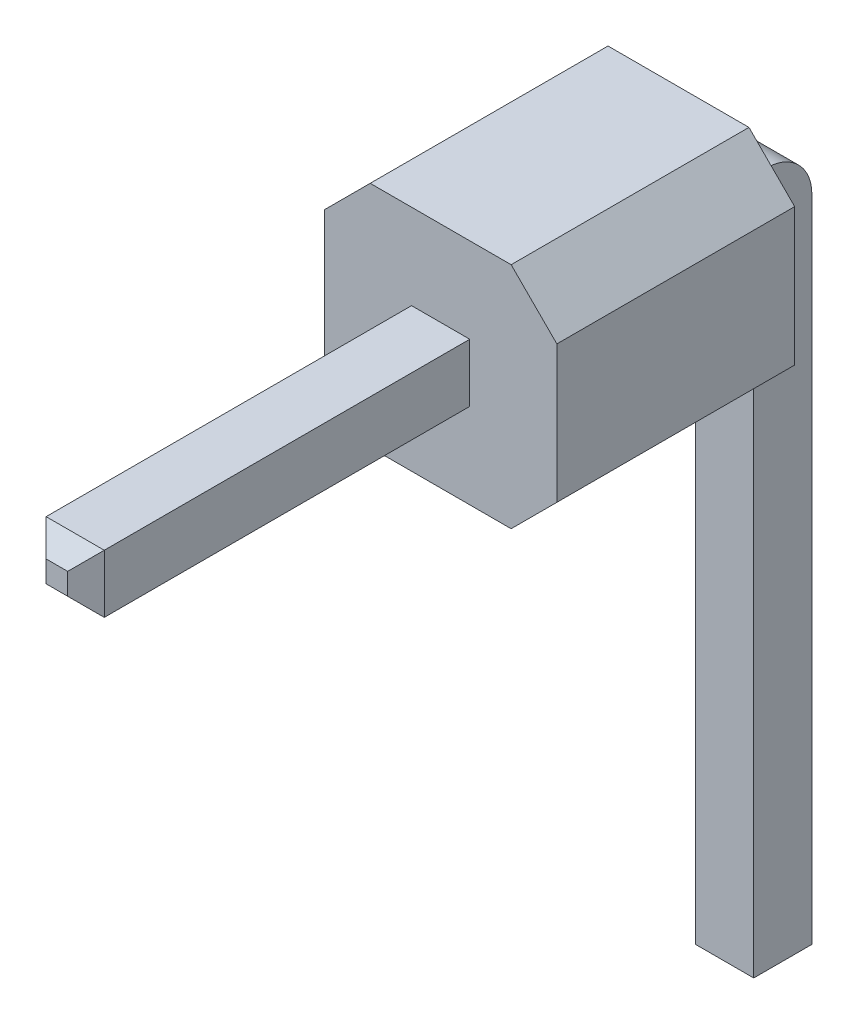
ISO-10303-21;
HEADER;
FILE_DESCRIPTION(('STEP AP214'),'2;1');
FILE_NAME('part.step','',(''),(''),'','','');
FILE_SCHEMA(('AUTOMOTIVE_DESIGN { 1 0 10303 214 1 1 1 1 }'));
ENDSEC;
DATA;
#1=APPLICATION_CONTEXT('core data for automotive mechanical design processes');
#2=APPLICATION_PROTOCOL_DEFINITION('international standard','automotive_design',2000,#1);
#3=PRODUCT_CONTEXT('',#1,'mechanical');
#4=PRODUCT('Part','Part','',(#3));
#5=PRODUCT_RELATED_PRODUCT_CATEGORY('part','',(#4));
#6=PRODUCT_DEFINITION_FORMATION('','',#4);
#7=PRODUCT_DEFINITION_CONTEXT('part definition',#1,'design');
#8=PRODUCT_DEFINITION('design','',#6,#7);
#9=PRODUCT_DEFINITION_SHAPE('','',#8);
#10=(LENGTH_UNIT() NAMED_UNIT(*) SI_UNIT(.MILLI.,.METRE.));
#11=(NAMED_UNIT(*) PLANE_ANGLE_UNIT() SI_UNIT($,.RADIAN.));
#12=(NAMED_UNIT(*) SI_UNIT($,.STERADIAN.) SOLID_ANGLE_UNIT());
#13=UNCERTAINTY_MEASURE_WITH_UNIT(LENGTH_MEASURE(1.E-05),#10,'distance_accuracy_value','');
#14=(GEOMETRIC_REPRESENTATION_CONTEXT(3) GLOBAL_UNCERTAINTY_ASSIGNED_CONTEXT((#13)) GLOBAL_UNIT_ASSIGNED_CONTEXT((#10,
#11,#12)) REPRESENTATION_CONTEXT('',''));
#15=CARTESIAN_POINT('',(0.,0.,0.));
#16=DIRECTION('',(0.,0.,1.));
#17=DIRECTION('',(1.,0.,0.));
#18=AXIS2_PLACEMENT_3D('',#15,#16,#17);
#19=CARTESIAN_POINT('',(0.148245527546587,-0.219972769428293,3.9));
#20=DIRECTION('',(0.,0.,1.));
#21=DIRECTION('',(1.,0.,0.));
#22=AXIS2_PLACEMENT_3D('',#19,#20,#21);
#23=PLANE('',#22);
#24=DIRECTION('',(0.,1.,0.));
#25=VECTOR('',#24,1.);
#26=CARTESIAN_POINT('',(0.148245527546587,0.416027230571708,3.9));
#27=LINE('',#26,#25);
#28=CARTESIAN_POINT('',(0.148245527546587,-0.219972769428293,3.9));
#29=VERTEX_POINT('',#28);
#30=CARTESIAN_POINT('',(0.148245527546587,0.416027230571708,3.9));
#31=VERTEX_POINT('',#30);
#32=EDGE_CURVE('P0_E11',#29,#31,#27,.T.);
#33=ORIENTED_EDGE('',*,*,#32,.T.);
#34=DIRECTION('',(-1.,0.,0.));
#35=VECTOR('',#34,1.);
#36=CARTESIAN_POINT('',(-0.487754472453413,0.416027230571707,3.9));
#37=LINE('',#36,#35);
#38=CARTESIAN_POINT('',(-0.487754472453413,0.416027230571707,3.9));
#39=VERTEX_POINT('',#38);
#40=EDGE_CURVE('P0_E29',#31,#39,#37,.T.);
#41=ORIENTED_EDGE('',*,*,#40,.T.);
#42=DIRECTION('',(0.,-1.,0.));
#43=VECTOR('',#42,1.);
#44=CARTESIAN_POINT('',(-0.487754472453413,0.416027230571707,3.9));
#45=LINE('',#44,#43);
#46=CARTESIAN_POINT('',(-0.487754472453413,-0.219972769428293,3.9));
#47=VERTEX_POINT('',#46);
#48=EDGE_CURVE('P0_E186',#39,#47,#45,.T.);
#49=ORIENTED_EDGE('',*,*,#48,.T.);
#50=DIRECTION('',(1.,0.,0.));
#51=VECTOR('',#50,1.);
#52=CARTESIAN_POINT('',(-0.487754472453413,-0.219972769428293,3.9));
#53=LINE('',#52,#51);
#54=EDGE_CURVE('P0_E184',#47,#29,#53,.T.);
#55=ORIENTED_EDGE('',*,*,#54,.T.);
#56=EDGE_LOOP('',(#33,#41,#49,#55));
#57=FACE_BOUND('',#56,.T.);
#58=ADVANCED_FACE('P0_F18',(#57),#23,.T.);
#59=CARTESIAN_POINT('',(0.148245527546587,0.416027230571708,1.3));
#60=DIRECTION('',(0.,0.,1.));
#61=DIRECTION('',(1.,0.,0.));
#62=AXIS2_PLACEMENT_3D('',#59,#60,#61);
#63=PLANE('',#62);
#64=DIRECTION('',(-1.,0.,0.));
#65=VECTOR('',#64,1.);
#66=CARTESIAN_POINT('',(-0.487754472453413,0.416027230571707,1.3));
#67=LINE('',#66,#65);
#68=CARTESIAN_POINT('',(0.148245527546587,0.416027230571708,1.3));
#69=VERTEX_POINT('',#68);
#70=CARTESIAN_POINT('',(-0.487754472453413,0.416027230571707,1.3));
#71=VERTEX_POINT('',#70);
#72=EDGE_CURVE('P0_E155',#69,#71,#67,.T.);
#73=ORIENTED_EDGE('',*,*,#72,.F.);
#74=DIRECTION('',(0.,1.,0.));
#75=VECTOR('',#74,1.);
#76=CARTESIAN_POINT('',(0.148245527546587,0.416027230571708,1.3));
#77=LINE('',#76,#75);
#78=CARTESIAN_POINT('',(0.148245527546587,-0.219972769428293,1.3));
#79=VERTEX_POINT('',#78);
#80=EDGE_CURVE('P0_E231',#79,#69,#77,.T.);
#81=ORIENTED_EDGE('',*,*,#80,.F.);
#82=DIRECTION('',(1.,0.,0.));
#83=VECTOR('',#82,1.);
#84=CARTESIAN_POINT('',(-0.487754472453413,-0.219972769428293,1.3));
#85=LINE('',#84,#83);
#86=CARTESIAN_POINT('',(-0.487754472453413,-0.219972769428293,1.3));
#87=VERTEX_POINT('',#86);
#88=EDGE_CURVE('P0_E214',#87,#79,#85,.T.);
#89=ORIENTED_EDGE('',*,*,#88,.F.);
#90=DIRECTION('',(0.,-1.,0.));
#91=VECTOR('',#90,1.);
#92=CARTESIAN_POINT('',(-0.487754472453413,0.416027230571707,1.3));
#93=LINE('',#92,#91);
#94=EDGE_CURVE('P0_E205',#71,#87,#93,.T.);
#95=ORIENTED_EDGE('',*,*,#94,.F.);
#96=EDGE_LOOP('',(#73,#81,#89,#95));
#97=FACE_BOUND('',#96,.T.);
#98=ADVANCED_FACE('P0_F388',(#97),#63,.F.);
#99=CARTESIAN_POINT('',(-1.44025447245341,0.848027230571708,3.9));
#100=DIRECTION('',(0.707106781186546,-0.707106781186549,0.));
#101=DIRECTION('',(0.,0.,-1.));
#102=AXIS2_PLACEMENT_3D('',#99,#100,#101);
#103=PLANE('',#102);
#104=DIRECTION('',(-0.707106781186549,-0.707106781186546,0.));
#105=VECTOR('',#104,1.);
#106=CARTESIAN_POINT('',(-1.19025447245341,1.09802723057171,3.9));
#107=LINE('',#106,#105);
#108=CARTESIAN_POINT('',(-0.940254472453412,1.34802723057171,3.9));
#109=VERTEX_POINT('',#108);
#110=CARTESIAN_POINT('',(-1.44025447245341,0.848027230571708,3.9));
#111=VERTEX_POINT('',#110);
#112=EDGE_CURVE('P0_E154',#109,#111,#107,.T.);
#113=ORIENTED_EDGE('',*,*,#112,.F.);
#114=DIRECTION('',(0.,0.,1.));
#115=VECTOR('',#114,1.);
#116=CARTESIAN_POINT('',(-0.940254472453412,1.34802723057171,3.9));
#117=LINE('',#116,#115);
#118=CARTESIAN_POINT('',(-0.940254472453412,1.34802723057171,1.3));
#119=VERTEX_POINT('',#118);
#120=EDGE_CURVE('P0_E372',#119,#109,#117,.T.);
#121=ORIENTED_EDGE('',*,*,#120,.F.);
#122=DIRECTION('',(0.707106781186549,0.707106781186546,0.));
#123=VECTOR('',#122,1.);
#124=CARTESIAN_POINT('',(-1.44025447245341,0.848027230571708,1.3));
#125=LINE('',#124,#123);
#126=CARTESIAN_POINT('',(-1.44025447245341,0.848027230571708,1.3));
#127=VERTEX_POINT('',#126);
#128=EDGE_CURVE('P0_E202',#127,#119,#125,.T.);
#129=ORIENTED_EDGE('',*,*,#128,.F.);
#130=DIRECTION('',(0.,0.,-1.));
#131=VECTOR('',#130,1.);
#132=CARTESIAN_POINT('',(-1.44025447245341,0.848027230571708,3.9));
#133=LINE('',#132,#131);
#134=EDGE_CURVE('P0_E206',#111,#127,#133,.T.);
#135=ORIENTED_EDGE('',*,*,#134,.F.);
#136=EDGE_LOOP('',(#113,#121,#129,#135));
#137=FACE_BOUND('',#136,.T.);
#138=ADVANCED_FACE('P0_F423',(#137),#103,.F.);
#139=CARTESIAN_POINT('',(-1.44025447245341,1.34802723057171,3.9));
#140=DIRECTION('',(0.,0.,1.));
#141=DIRECTION('',(1.,0.,0.));
#142=AXIS2_PLACEMENT_3D('',#139,#140,#141);
#143=PLANE('',#142);
#144=ORIENTED_EDGE('',*,*,#54,.F.);
#145=ORIENTED_EDGE('',*,*,#48,.F.);
#146=ORIENTED_EDGE('',*,*,#40,.F.);
#147=ORIENTED_EDGE('',*,*,#32,.F.);
#148=EDGE_LOOP('',(#144,#145,#146,#147));
#149=FACE_BOUND('',#148,.T.);
#150=DIRECTION('',(1.,0.,0.));
#151=VECTOR('',#150,1.);
#152=CARTESIAN_POINT('',(-1.44025447245341,-1.15197276942829,3.9));
#153=LINE('',#152,#151);
#154=CARTESIAN_POINT('',(-0.940254472453414,-1.15197276942829,3.9));
#155=VERTEX_POINT('',#154);
#156=CARTESIAN_POINT('',(0.600745527546586,-1.15197276942829,3.9));
#157=VERTEX_POINT('',#156);
#158=EDGE_CURVE('P0_E146',#155,#157,#153,.T.);
#159=ORIENTED_EDGE('',*,*,#158,.T.);
#160=DIRECTION('',(0.707106781186549,0.707106781186546,0.));
#161=VECTOR('',#160,1.);
#162=CARTESIAN_POINT('',(0.830245527546584,-0.922472769428297,3.9));
#163=LINE('',#162,#161);
#164=CARTESIAN_POINT('',(1.10074552754659,-0.651972769428294,3.9));
#165=VERTEX_POINT('',#164);
#166=EDGE_CURVE('P0_E150',#157,#165,#163,.T.);
#167=ORIENTED_EDGE('',*,*,#166,.T.);
#168=DIRECTION('',(0.,1.,0.));
#169=VECTOR('',#168,1.);
#170=CARTESIAN_POINT('',(1.10074552754659,1.34802723057171,3.9));
#171=LINE('',#170,#169);
#172=CARTESIAN_POINT('',(1.10074552754659,0.848027230571706,3.9));
#173=VERTEX_POINT('',#172);
#174=EDGE_CURVE('P0_E217',#165,#173,#171,.T.);
#175=ORIENTED_EDGE('',*,*,#174,.T.);
#176=DIRECTION('',(-0.707106781186546,0.707106781186549,0.));
#177=VECTOR('',#176,1.);
#178=CARTESIAN_POINT('',(-0.419754472453409,2.36852723057171,3.9));
#179=LINE('',#178,#177);
#180=CARTESIAN_POINT('',(0.600745527546588,1.34802723057171,3.9));
#181=VERTEX_POINT('',#180);
#182=EDGE_CURVE('P0_E669',#173,#181,#179,.T.);
#183=ORIENTED_EDGE('',*,*,#182,.T.);
#184=DIRECTION('',(-1.,0.,0.));
#185=VECTOR('',#184,1.);
#186=CARTESIAN_POINT('',(-1.44025447245341,1.34802723057171,3.9));
#187=LINE('',#186,#185);
#188=EDGE_CURVE('P0_E223',#181,#109,#187,.T.);
#189=ORIENTED_EDGE('',*,*,#188,.T.);
#190=ORIENTED_EDGE('',*,*,#112,.T.);
#191=DIRECTION('',(0.,-1.,0.));
#192=VECTOR('',#191,1.);
#193=CARTESIAN_POINT('',(-1.44025447245341,1.34802723057171,3.9));
#194=LINE('',#193,#192);
#195=CARTESIAN_POINT('',(-1.44025447245341,-0.651972769428293,3.9));
#196=VERTEX_POINT('',#195);
#197=EDGE_CURVE('P0_E209',#111,#196,#194,.T.);
#198=ORIENTED_EDGE('',*,*,#197,.T.);
#199=DIRECTION('',(0.707106781186546,-0.707106781186549,0.));
#200=VECTOR('',#199,1.);
#201=CARTESIAN_POINT('',(-2.44025447245341,0.348027230571711,3.9));
#202=LINE('',#201,#200);
#203=EDGE_CURVE('P0_E97',#196,#155,#202,.T.);
#204=ORIENTED_EDGE('',*,*,#203,.T.);
#205=EDGE_LOOP('',(#159,#167,#175,#183,#189,#190,#198,#204));
#206=FACE_BOUND('',#205,.T.);
#207=ADVANCED_FACE('P0_F148',(#149,#206),#143,.T.);
#208=CARTESIAN_POINT('',(-1.44025447245341,-1.15197276942829,3.9));
#209=DIRECTION('',(0.,1.,0.));
#210=DIRECTION('',(1.,0.,0.));
#211=AXIS2_PLACEMENT_3D('',#208,#209,#210);
#212=PLANE('',#211);
#213=DIRECTION('',(1.,0.,0.));
#214=VECTOR('',#213,1.);
#215=CARTESIAN_POINT('',(-1.44025447245341,-1.15197276942829,1.3));
#216=LINE('',#215,#214);
#217=CARTESIAN_POINT('',(-0.940254472453414,-1.15197276942829,1.3));
#218=VERTEX_POINT('',#217);
#219=CARTESIAN_POINT('',(0.600745527546587,-1.15197276942829,1.3));
#220=VERTEX_POINT('',#219);
#221=EDGE_CURVE('P0_E160',#218,#220,#216,.T.);
#222=ORIENTED_EDGE('',*,*,#221,.T.);
#223=DIRECTION('',(0.,0.,1.));
#224=VECTOR('',#223,1.);
#225=CARTESIAN_POINT('',(0.600745527546587,-1.15197276942829,3.9));
#226=LINE('',#225,#224);
#227=EDGE_CURVE('P0_E158',#220,#157,#226,.T.);
#228=ORIENTED_EDGE('',*,*,#227,.T.);
#229=ORIENTED_EDGE('',*,*,#158,.F.);
#230=DIRECTION('',(0.,0.,-1.));
#231=VECTOR('',#230,1.);
#232=CARTESIAN_POINT('',(-0.940254472453414,-1.15197276942829,3.9));
#233=LINE('',#232,#231);
#234=EDGE_CURVE('P0_E22',#155,#218,#233,.T.);
#235=ORIENTED_EDGE('',*,*,#234,.T.);
#236=EDGE_LOOP('',(#222,#228,#229,#235));
#237=FACE_BOUND('',#236,.T.);
#238=ADVANCED_FACE('P0_F159',(#237),#212,.F.);
#239=CARTESIAN_POINT('',(-1.44025447245341,1.34802723057171,1.3));
#240=DIRECTION('',(0.,0.,1.));
#241=DIRECTION('',(1.,0.,0.));
#242=AXIS2_PLACEMENT_3D('',#239,#240,#241);
#243=PLANE('',#242);
#244=ORIENTED_EDGE('',*,*,#94,.T.);
#245=ORIENTED_EDGE('',*,*,#88,.T.);
#246=ORIENTED_EDGE('',*,*,#80,.T.);
#247=ORIENTED_EDGE('',*,*,#72,.T.);
#248=EDGE_LOOP('',(#244,#245,#246,#247));
#249=FACE_BOUND('',#248,.T.);
#250=DIRECTION('',(0.,1.,0.));
#251=VECTOR('',#250,1.);
#252=CARTESIAN_POINT('',(1.10074552754659,1.34802723057171,1.3));
#253=LINE('',#252,#251);
#254=CARTESIAN_POINT('',(1.10074552754659,-0.651972769428294,1.3));
#255=VERTEX_POINT('',#254);
#256=CARTESIAN_POINT('',(1.10074552754659,0.848027230571706,1.3));
#257=VERTEX_POINT('',#256);
#258=EDGE_CURVE('P0_E220',#255,#257,#253,.T.);
#259=ORIENTED_EDGE('',*,*,#258,.F.);
#260=DIRECTION('',(-0.707106781186549,-0.707106781186546,0.));
#261=VECTOR('',#260,1.);
#262=CARTESIAN_POINT('',(1.10074552754659,-0.651972769428294,1.3));
#263=LINE('',#262,#261);
#264=EDGE_CURVE('P0_E165',#255,#220,#263,.T.);
#265=ORIENTED_EDGE('',*,*,#264,.T.);
#266=ORIENTED_EDGE('',*,*,#221,.F.);
#267=DIRECTION('',(-0.707106781186546,0.707106781186549,0.));
#268=VECTOR('',#267,1.);
#269=CARTESIAN_POINT('',(-0.940254472453414,-1.15197276942829,1.3));
#270=LINE('',#269,#268);
#271=CARTESIAN_POINT('',(-1.44025447245341,-0.651972769428293,1.3));
#272=VERTEX_POINT('',#271);
#273=EDGE_CURVE('P0_E112',#218,#272,#270,.T.);
#274=ORIENTED_EDGE('',*,*,#273,.T.);
#275=DIRECTION('',(0.,-1.,0.));
#276=VECTOR('',#275,1.);
#277=CARTESIAN_POINT('',(-1.44025447245341,1.34802723057171,1.3));
#278=LINE('',#277,#276);
#279=EDGE_CURVE('P0_E270',#127,#272,#278,.T.);
#280=ORIENTED_EDGE('',*,*,#279,.F.);
#281=ORIENTED_EDGE('',*,*,#128,.T.);
#282=DIRECTION('',(-1.,0.,0.));
#283=VECTOR('',#282,1.);
#284=CARTESIAN_POINT('',(-1.44025447245341,1.34802723057171,1.3));
#285=LINE('',#284,#283);
#286=CARTESIAN_POINT('',(0.600745527546587,1.34802723057171,1.3));
#287=VERTEX_POINT('',#286);
#288=EDGE_CURVE('P0_E182',#287,#119,#285,.T.);
#289=ORIENTED_EDGE('',*,*,#288,.F.);
#290=DIRECTION('',(0.707106781186546,-0.707106781186549,0.));
#291=VECTOR('',#290,1.);
#292=CARTESIAN_POINT('',(0.600745527546588,1.34802723057171,1.3));
#293=LINE('',#292,#291);
#294=EDGE_CURVE('P0_E172',#287,#257,#293,.T.);
#295=ORIENTED_EDGE('',*,*,#294,.T.);
#296=EDGE_LOOP('',(#259,#265,#266,#274,#280,#281,#289,#295));
#297=FACE_BOUND('',#296,.T.);
#298=ADVANCED_FACE('P0_F20',(#249,#297),#243,.F.);
#299=CARTESIAN_POINT('',(1.10074552754659,1.34802723057171,3.9));
#300=DIRECTION('',(-1.,0.,0.));
#301=DIRECTION('',(0.,0.,1.));
#302=AXIS2_PLACEMENT_3D('',#299,#300,#301);
#303=PLANE('',#302);
#304=ORIENTED_EDGE('',*,*,#174,.F.);
#305=DIRECTION('',(0.,0.,-1.));
#306=VECTOR('',#305,1.);
#307=CARTESIAN_POINT('',(1.10074552754659,-0.651972769428294,3.9));
#308=LINE('',#307,#306);
#309=EDGE_CURVE('P0_E170',#165,#255,#308,.T.);
#310=ORIENTED_EDGE('',*,*,#309,.T.);
#311=ORIENTED_EDGE('',*,*,#258,.T.);
#312=DIRECTION('',(0.,0.,1.));
#313=VECTOR('',#312,1.);
#314=CARTESIAN_POINT('',(1.10074552754659,0.848027230571706,3.9));
#315=LINE('',#314,#313);
#316=EDGE_CURVE('P0_E179',#257,#173,#315,.T.);
#317=ORIENTED_EDGE('',*,*,#316,.T.);
#318=EDGE_LOOP('',(#304,#310,#311,#317));
#319=FACE_BOUND('',#318,.T.);
#320=ADVANCED_FACE('P0_F398',(#319),#303,.F.);
#321=CARTESIAN_POINT('',(1.10074552754659,-0.651972769428294,3.9));
#322=DIRECTION('',(-0.707106781186546,0.707106781186549,0.));
#323=DIRECTION('',(0.,0.,1.));
#324=AXIS2_PLACEMENT_3D('',#321,#322,#323);
#325=PLANE('',#324);
#326=ORIENTED_EDGE('',*,*,#166,.F.);
#327=ORIENTED_EDGE('',*,*,#227,.F.);
#328=ORIENTED_EDGE('',*,*,#264,.F.);
#329=ORIENTED_EDGE('',*,*,#309,.F.);
#330=EDGE_LOOP('',(#326,#327,#328,#329));
#331=FACE_BOUND('',#330,.T.);
#332=ADVANCED_FACE('P0_F168',(#331),#325,.F.);
#333=CARTESIAN_POINT('',(0.600745527546588,1.34802723057171,3.9));
#334=DIRECTION('',(-0.707106781186549,-0.707106781186546,0.));
#335=DIRECTION('',(-0.707106781186546,0.707106781186549,0.));
#336=AXIS2_PLACEMENT_3D('',#333,#334,#335);
#337=PLANE('',#336);
#338=ORIENTED_EDGE('',*,*,#182,.F.);
#339=ORIENTED_EDGE('',*,*,#316,.F.);
#340=ORIENTED_EDGE('',*,*,#294,.F.);
#341=DIRECTION('',(0.,0.,-1.));
#342=VECTOR('',#341,1.);
#343=CARTESIAN_POINT('',(0.600745527546588,1.34802723057171,3.9));
#344=LINE('',#343,#342);
#345=EDGE_CURVE('P0_E226',#181,#287,#344,.T.);
#346=ORIENTED_EDGE('',*,*,#345,.F.);
#347=EDGE_LOOP('',(#338,#339,#340,#346));
#348=FACE_BOUND('',#347,.T.);
#349=ADVANCED_FACE('P0_F397',(#348),#337,.F.);
#350=CARTESIAN_POINT('',(-1.44025447245341,1.34802723057171,3.9));
#351=DIRECTION('',(0.,-1.,0.));
#352=DIRECTION('',(0.,0.,-1.));
#353=AXIS2_PLACEMENT_3D('',#350,#351,#352);
#354=PLANE('',#353);
#355=ORIENTED_EDGE('',*,*,#188,.F.);
#356=ORIENTED_EDGE('',*,*,#345,.T.);
#357=ORIENTED_EDGE('',*,*,#288,.T.);
#358=ORIENTED_EDGE('',*,*,#120,.T.);
#359=EDGE_LOOP('',(#355,#356,#357,#358));
#360=FACE_BOUND('',#359,.T.);
#361=ADVANCED_FACE('P0_F439',(#360),#354,.F.);
#362=CARTESIAN_POINT('',(-0.940254472453414,-1.15197276942829,3.9));
#363=DIRECTION('',(0.707106781186549,0.707106781186546,0.));
#364=DIRECTION('',(0.,0.,-1.));
#365=AXIS2_PLACEMENT_3D('',#362,#363,#364);
#366=PLANE('',#365);
#367=ORIENTED_EDGE('',*,*,#203,.F.);
#368=DIRECTION('',(0.,0.,1.));
#369=VECTOR('',#368,1.);
#370=CARTESIAN_POINT('',(-1.44025447245341,-0.651972769428293,3.9));
#371=LINE('',#370,#369);
#372=EDGE_CURVE('P0_E260',#272,#196,#371,.T.);
#373=ORIENTED_EDGE('',*,*,#372,.F.);
#374=ORIENTED_EDGE('',*,*,#273,.F.);
#375=ORIENTED_EDGE('',*,*,#234,.F.);
#376=EDGE_LOOP('',(#367,#373,#374,#375));
#377=FACE_BOUND('',#376,.T.);
#378=ADVANCED_FACE('P0_F411',(#377),#366,.F.);
#379=CARTESIAN_POINT('',(-1.44025447245341,1.34802723057171,3.9));
#380=DIRECTION('',(1.,0.,0.));
#381=DIRECTION('',(0.,1.,0.));
#382=AXIS2_PLACEMENT_3D('',#379,#380,#381);
#383=PLANE('',#382);
#384=ORIENTED_EDGE('',*,*,#279,.T.);
#385=ORIENTED_EDGE('',*,*,#372,.T.);
#386=ORIENTED_EDGE('',*,*,#197,.F.);
#387=ORIENTED_EDGE('',*,*,#134,.T.);
#388=EDGE_LOOP('',(#384,#385,#386,#387));
#389=FACE_BOUND('',#388,.T.);
#390=ADVANCED_FACE('P0_F407',(#389),#383,.F.);
#391=CLOSED_SHELL('',(#58,#98,#138,#207,#238,#298,#320,#332,#349,#361,#378,#390));
#392=MANIFOLD_SOLID_BREP('P0_B1',#391);
#393=CARTESIAN_POINT('',(-0.487754472453413,-0.719972769428292,1.29548073));
#394=DIRECTION('',(-1.,0.,0.));
#395=DIRECTION('',(0.,0.,1.));
#396=AXIS2_PLACEMENT_3D('',#393,#394,#395);
#397=CYLINDRICAL_SURFACE('',#396,0.5);
#398=CARTESIAN_POINT('',(-0.487754472453413,-0.719972769428292,1.29548073));
#399=DIRECTION('',(1.,0.,0.));
#400=DIRECTION('',(0.,0.,-1.));
#401=AXIS2_PLACEMENT_3D('',#398,#399,#400);
#402=CIRCLE('',#401,0.5);
#403=CARTESIAN_POINT('',(-0.487754472453413,-0.719972769428292,0.79548073));
#404=VERTEX_POINT('',#403);
#405=CARTESIAN_POINT('',(-0.487754472453413,-0.219972769428292,1.29548073));
#406=VERTEX_POINT('',#405);
#407=EDGE_CURVE('P1_E11',#404,#406,#402,.T.);
#408=ORIENTED_EDGE('',*,*,#407,.F.);
#409=DIRECTION('',(-1.,0.,0.));
#410=VECTOR('',#409,1.);
#411=CARTESIAN_POINT('',(-0.487754472453413,-0.719972769428292,0.79548073));
#412=LINE('',#411,#410);
#413=CARTESIAN_POINT('',(0.148245527546587,-0.719972769428292,0.79548073));
#414=VERTEX_POINT('',#413);
#415=EDGE_CURVE('P1_E138',#414,#404,#412,.T.);
#416=ORIENTED_EDGE('',*,*,#415,.F.);
#417=CARTESIAN_POINT('',(0.148245527546588,-0.719972769428292,1.29548073));
#418=DIRECTION('',(-1.,0.,0.));
#419=DIRECTION('',(0.,0.,1.));
#420=AXIS2_PLACEMENT_3D('',#417,#418,#419);
#421=CIRCLE('',#420,0.5);
#422=CARTESIAN_POINT('',(0.148245527546587,-0.219972769428292,1.29548073));
#423=VERTEX_POINT('',#422);
#424=EDGE_CURVE('P1_E21',#423,#414,#421,.T.);
#425=ORIENTED_EDGE('',*,*,#424,.F.);
#426=DIRECTION('',(1.,0.,0.));
#427=VECTOR('',#426,1.);
#428=CARTESIAN_POINT('',(0.148245527546587,-0.219972769428292,1.29548073));
#429=LINE('',#428,#427);
#430=EDGE_CURVE('P1_E179',#406,#423,#429,.T.);
#431=ORIENTED_EDGE('',*,*,#430,.F.);
#432=EDGE_LOOP('',(#408,#416,#425,#431));
#433=FACE_BOUND('',#432,.T.);
#434=ADVANCED_FACE('P1_F17',(#433),#397,.F.);
#435=CARTESIAN_POINT('',(-0.487754472453413,0.416027230571708,0.15948073));
#436=DIRECTION('',(1.,0.,0.));
#437=DIRECTION('',(0.,0.,-1.));
#438=AXIS2_PLACEMENT_3D('',#435,#436,#437);
#439=PLANE('',#438);
#440=DIRECTION('',(0.,-1.,0.));
#441=VECTOR('',#440,1.);
#442=CARTESIAN_POINT('',(-0.487754472453413,0.416027230571708,0.15948073));
#443=LINE('',#442,#441);
#444=CARTESIAN_POINT('',(-0.487754472453413,-0.0839727694282927,0.15948073));
#445=VERTEX_POINT('',#444);
#446=CARTESIAN_POINT('',(-0.487754472453413,-7.18397276942829,0.15948073));
#447=VERTEX_POINT('',#446);
#448=EDGE_CURVE('P1_E28',#445,#447,#443,.T.);
#449=ORIENTED_EDGE('',*,*,#448,.T.);
#450=DIRECTION('',(0.,0.,1.));
#451=VECTOR('',#450,1.);
#452=CARTESIAN_POINT('',(-0.487754472453413,-7.18397276942829,0.15948073));
#453=LINE('',#452,#451);
#454=CARTESIAN_POINT('',(-0.487754472453413,-7.18397276942829,0.79548073));
#455=VERTEX_POINT('',#454);
#456=EDGE_CURVE('P1_E211',#447,#455,#453,.T.);
#457=ORIENTED_EDGE('',*,*,#456,.T.);
#458=DIRECTION('',(0.,-1.,0.));
#459=VECTOR('',#458,1.);
#460=CARTESIAN_POINT('',(-0.487754472453413,0.416027230571708,0.79548073));
#461=LINE('',#460,#459);
#462=EDGE_CURVE('P1_E139',#404,#455,#461,.T.);
#463=ORIENTED_EDGE('',*,*,#462,.F.);
#464=ORIENTED_EDGE('',*,*,#407,.T.);
#465=DIRECTION('',(0.,0.,-1.));
#466=VECTOR('',#465,1.);
#467=CARTESIAN_POINT('',(-0.487754472453413,-0.219972769428292,8.09548073));
#468=LINE('',#467,#466);
#469=CARTESIAN_POINT('',(-0.487754472453413,-0.219972769428292,7.89548073));
#470=VERTEX_POINT('',#469);
#471=EDGE_CURVE('P1_E175',#470,#406,#468,.T.);
#472=ORIENTED_EDGE('',*,*,#471,.F.);
#473=DIRECTION('',(0.,1.,0.));
#474=VECTOR('',#473,1.);
#475=CARTESIAN_POINT('',(-0.487754472453412,0.416027230571708,7.89548073));
#476=LINE('',#475,#474);
#477=CARTESIAN_POINT('',(-0.487754472453412,0.416027230571708,7.89548073));
#478=VERTEX_POINT('',#477);
#479=EDGE_CURVE('P1_E187',#470,#478,#476,.T.);
#480=ORIENTED_EDGE('',*,*,#479,.T.);
#481=DIRECTION('',(0.,0.,1.));
#482=VECTOR('',#481,1.);
#483=CARTESIAN_POINT('',(-0.487754472453413,0.416027230571708,0.15948073));
#484=LINE('',#483,#482);
#485=CARTESIAN_POINT('',(-0.487754472453413,0.416027230571708,0.65948073));
#486=VERTEX_POINT('',#485);
#487=EDGE_CURVE('P1_E257',#486,#478,#484,.T.);
#488=ORIENTED_EDGE('',*,*,#487,.F.);
#489=CARTESIAN_POINT('',(-0.487754472453413,-0.0839727694282927,0.65948073));
#490=DIRECTION('',(-1.,0.,0.));
#491=DIRECTION('',(0.,0.,-1.));
#492=AXIS2_PLACEMENT_3D('',#489,#490,#491);
#493=CIRCLE('',#492,0.5);
#494=EDGE_CURVE('P1_E222',#486,#445,#493,.T.);
#495=ORIENTED_EDGE('',*,*,#494,.T.);
#496=EDGE_LOOP('',(#449,#457,#463,#464,#472,#480,#488,#495));
#497=FACE_BOUND('',#496,.T.);
#498=ADVANCED_FACE('P1_F293',(#497),#439,.F.);
#499=CARTESIAN_POINT('',(-0.487754472453413,0.416027230571708,0.15948073));
#500=DIRECTION('',(0.,0.,1.));
#501=DIRECTION('',(1.,0.,0.));
#502=AXIS2_PLACEMENT_3D('',#499,#500,#501);
#503=PLANE('',#502);
#504=DIRECTION('',(0.,-1.,0.));
#505=VECTOR('',#504,1.);
#506=CARTESIAN_POINT('',(0.148245527546587,0.416027230571708,0.15948073));
#507=LINE('',#506,#505);
#508=CARTESIAN_POINT('',(0.148245527546587,-0.0839727694282927,0.15948073));
#509=VERTEX_POINT('',#508);
#510=CARTESIAN_POINT('',(0.148245527546587,-7.18397276942829,0.15948073));
#511=VERTEX_POINT('',#510);
#512=EDGE_CURVE('P1_E217',#509,#511,#507,.T.);
#513=ORIENTED_EDGE('',*,*,#512,.T.);
#514=DIRECTION('',(-1.,0.,0.));
#515=VECTOR('',#514,1.);
#516=CARTESIAN_POINT('',(-0.487754472453413,-7.18397276942829,0.15948073));
#517=LINE('',#516,#515);
#518=EDGE_CURVE('P1_E260',#511,#447,#517,.T.);
#519=ORIENTED_EDGE('',*,*,#518,.T.);
#520=ORIENTED_EDGE('',*,*,#448,.F.);
#521=DIRECTION('',(1.,0.,0.));
#522=VECTOR('',#521,1.);
#523=CARTESIAN_POINT('',(0.148245527546587,-0.0839727694282927,0.15948073));
#524=LINE('',#523,#522);
#525=EDGE_CURVE('P1_E219',#445,#509,#524,.T.);
#526=ORIENTED_EDGE('',*,*,#525,.T.);
#527=EDGE_LOOP('',(#513,#519,#520,#526));
#528=FACE_BOUND('',#527,.T.);
#529=ADVANCED_FACE('P1_F362',(#528),#503,.F.);
#530=CARTESIAN_POINT('',(0.148245527546587,0.416027230571708,0.15948073));
#531=DIRECTION('',(-1.,0.,0.));
#532=DIRECTION('',(0.,1.,0.));
#533=AXIS2_PLACEMENT_3D('',#530,#531,#532);
#534=PLANE('',#533);
#535=DIRECTION('',(0.,-1.,0.));
#536=VECTOR('',#535,1.);
#537=CARTESIAN_POINT('',(0.148245527546587,0.416027230571708,0.79548073));
#538=LINE('',#537,#536);
#539=CARTESIAN_POINT('',(0.148245527546587,-7.18397276942829,0.79548073));
#540=VERTEX_POINT('',#539);
#541=EDGE_CURVE('P1_E128',#414,#540,#538,.T.);
#542=ORIENTED_EDGE('',*,*,#541,.T.);
#543=DIRECTION('',(0.,0.,-1.));
#544=VECTOR('',#543,1.);
#545=CARTESIAN_POINT('',(0.148245527546587,-7.18397276942829,0.15948073));
#546=LINE('',#545,#544);
#547=EDGE_CURVE('P1_E133',#540,#511,#546,.T.);
#548=ORIENTED_EDGE('',*,*,#547,.T.);
#549=ORIENTED_EDGE('',*,*,#512,.F.);
#550=CARTESIAN_POINT('',(0.148245527546587,-0.0839727694282927,0.65948073));
#551=DIRECTION('',(1.,0.,0.));
#552=DIRECTION('',(0.,0.,1.));
#553=AXIS2_PLACEMENT_3D('',#550,#551,#552);
#554=CIRCLE('',#553,0.5);
#555=CARTESIAN_POINT('',(0.148245527546587,0.416027230571708,0.65948073));
#556=VERTEX_POINT('',#555);
#557=EDGE_CURVE('P1_E223',#509,#556,#554,.T.);
#558=ORIENTED_EDGE('',*,*,#557,.T.);
#559=DIRECTION('',(0.,0.,-1.));
#560=VECTOR('',#559,1.);
#561=CARTESIAN_POINT('',(0.148245527546587,0.416027230571708,0.15948073));
#562=LINE('',#561,#560);
#563=CARTESIAN_POINT('',(0.148245527546589,0.416027230571708,7.89548073));
#564=VERTEX_POINT('',#563);
#565=EDGE_CURVE('P1_E239',#564,#556,#562,.T.);
#566=ORIENTED_EDGE('',*,*,#565,.F.);
#567=DIRECTION('',(0.,-1.,0.));
#568=VECTOR('',#567,1.);
#569=CARTESIAN_POINT('',(0.148245527546589,-0.219972769428292,7.89548073));
#570=LINE('',#569,#568);
#571=CARTESIAN_POINT('',(0.148245527546587,-0.219972769428292,7.89548073));
#572=VERTEX_POINT('',#571);
#573=EDGE_CURVE('P1_E189',#564,#572,#570,.T.);
#574=ORIENTED_EDGE('',*,*,#573,.T.);
#575=DIRECTION('',(0.,0.,-1.));
#576=VECTOR('',#575,1.);
#577=CARTESIAN_POINT('',(0.148245527546587,-0.219972769428292,8.09548073));
#578=LINE('',#577,#576);
#579=EDGE_CURVE('P1_E196',#572,#423,#578,.T.);
#580=ORIENTED_EDGE('',*,*,#579,.T.);
#581=ORIENTED_EDGE('',*,*,#424,.T.);
#582=EDGE_LOOP('',(#542,#548,#549,#558,#566,#574,#580,#581));
#583=FACE_BOUND('',#582,.T.);
#584=ADVANCED_FACE('P1_F130',(#583),#534,.F.);
#585=CARTESIAN_POINT('',(-0.487754472453413,0.416027230571708,0.79548073));
#586=DIRECTION('',(0.,0.,-1.));
#587=DIRECTION('',(0.,-1.,0.));
#588=AXIS2_PLACEMENT_3D('',#585,#586,#587);
#589=PLANE('',#588);
#590=ORIENTED_EDGE('',*,*,#462,.T.);
#591=DIRECTION('',(1.,0.,0.));
#592=VECTOR('',#591,1.);
#593=CARTESIAN_POINT('',(-0.487754472453413,-7.18397276942829,0.79548073));
#594=LINE('',#593,#592);
#595=EDGE_CURVE('P1_E142',#455,#540,#594,.T.);
#596=ORIENTED_EDGE('',*,*,#595,.T.);
#597=ORIENTED_EDGE('',*,*,#541,.F.);
#598=ORIENTED_EDGE('',*,*,#415,.T.);
#599=EDGE_LOOP('',(#590,#596,#597,#598));
#600=FACE_BOUND('',#599,.T.);
#601=ADVANCED_FACE('P1_F143',(#600),#589,.F.);
#602=CARTESIAN_POINT('',(-0.487754472453413,-7.18397276942829,0.79548073));
#603=DIRECTION('',(0.,0.707106781186551,-0.707106781186545));
#604=DIRECTION('',(-1.,0.,0.));
#605=AXIS2_PLACEMENT_3D('',#602,#603,#604);
#606=PLANE('',#605);
#607=DIRECTION('',(0.577350269189628,0.577350269189622,0.577350269189627));
#608=VECTOR('',#607,1.);
#609=CARTESIAN_POINT('',(-0.0637544724534139,-7.39597276942829,0.583480729999999));
#610=LINE('',#609,#608);
#611=CARTESIAN_POINT('',(-0.0517544724534148,-7.38397276942829,0.595480729999998));
#612=VERTEX_POINT('',#611);
#613=EDGE_CURVE('P1_E154',#612,#540,#610,.T.);
#614=ORIENTED_EDGE('',*,*,#613,.T.);
#615=ORIENTED_EDGE('',*,*,#595,.F.);
#616=DIRECTION('',(-0.577350269189627,0.577350269189623,0.577350269189628));
#617=VECTOR('',#616,1.);
#618=CARTESIAN_POINT('',(-0.487754472453413,-7.18397276942829,0.79548073));
#619=LINE('',#618,#617);
#620=CARTESIAN_POINT('',(-0.28775447245341,-7.38397276942829,0.595480729999998));
#621=VERTEX_POINT('',#620);
#622=EDGE_CURVE('P1_E214',#621,#455,#619,.T.);
#623=ORIENTED_EDGE('',*,*,#622,.F.);
#624=DIRECTION('',(-1.,0.,0.));
#625=VECTOR('',#624,1.);
#626=CARTESIAN_POINT('',(-0.487754472453413,-7.38397276942829,0.595480729999998));
#627=LINE('',#626,#625);
#628=EDGE_CURVE('P1_E162',#612,#621,#627,.T.);
#629=ORIENTED_EDGE('',*,*,#628,.F.);
#630=EDGE_LOOP('',(#614,#615,#623,#629));
#631=FACE_BOUND('',#630,.T.);
#632=ADVANCED_FACE('P1_F161',(#631),#606,.F.);
#633=CARTESIAN_POINT('',(0.148245527546587,-7.18397276942829,0.15948073));
#634=DIRECTION('',(-0.707106781186545,0.707106781186551,0.));
#635=DIRECTION('',(0.,0.,1.));
#636=AXIS2_PLACEMENT_3D('',#633,#634,#635);
#637=PLANE('',#636);
#638=ORIENTED_EDGE('',*,*,#613,.F.);
#639=DIRECTION('',(0.,0.,1.));
#640=VECTOR('',#639,1.);
#641=CARTESIAN_POINT('',(-0.0517544724534149,-7.38397276942829,0.15948073));
#642=LINE('',#641,#640);
#643=CARTESIAN_POINT('',(-0.0517544724534148,-7.38397276942829,0.359480730000002));
#644=VERTEX_POINT('',#643);
#645=EDGE_CURVE('P1_E164',#644,#612,#642,.T.);
#646=ORIENTED_EDGE('',*,*,#645,.F.);
#647=DIRECTION('',(-0.577350269189627,-0.577350269189623,0.577350269189628));
#648=VECTOR('',#647,1.);
#649=CARTESIAN_POINT('',(0.148245527546587,-7.18397276942829,0.15948073));
#650=LINE('',#649,#648);
#651=EDGE_CURVE('P1_E157',#511,#644,#650,.T.);
#652=ORIENTED_EDGE('',*,*,#651,.F.);
#653=ORIENTED_EDGE('',*,*,#547,.F.);
#654=EDGE_LOOP('',(#638,#646,#652,#653));
#655=FACE_BOUND('',#654,.T.);
#656=ADVANCED_FACE('P1_F153',(#655),#637,.F.);
#657=CARTESIAN_POINT('',(-0.487754472453413,-7.38397276942829,0.15948073));
#658=DIRECTION('',(0.,1.,0.));
#659=DIRECTION('',(1.,0.,0.));
#660=AXIS2_PLACEMENT_3D('',#657,#658,#659);
#661=PLANE('',#660);
#662=ORIENTED_EDGE('',*,*,#628,.T.);
#663=DIRECTION('',(0.,0.,-1.));
#664=VECTOR('',#663,1.);
#665=CARTESIAN_POINT('',(-0.28775447245341,-7.38397276942829,0.15948073));
#666=LINE('',#665,#664);
#667=CARTESIAN_POINT('',(-0.28775447245341,-7.38397276942829,0.359480730000002));
#668=VERTEX_POINT('',#667);
#669=EDGE_CURVE('P1_E250',#621,#668,#666,.T.);
#670=ORIENTED_EDGE('',*,*,#669,.T.);
#671=DIRECTION('',(1.,0.,0.));
#672=VECTOR('',#671,1.);
#673=CARTESIAN_POINT('',(-0.487754472453413,-7.38397276942829,0.359480730000002));
#674=LINE('',#673,#672);
#675=EDGE_CURVE('P1_E271',#668,#644,#674,.T.);
#676=ORIENTED_EDGE('',*,*,#675,.T.);
#677=ORIENTED_EDGE('',*,*,#645,.T.);
#678=EDGE_LOOP('',(#662,#670,#676,#677));
#679=FACE_BOUND('',#678,.T.);
#680=ADVANCED_FACE('P1_F298',(#679),#661,.F.);
#681=CARTESIAN_POINT('',(-0.487754472453413,-7.18397276942829,0.15948073));
#682=DIRECTION('',(0.707106781186545,0.707106781186551,0.));
#683=DIRECTION('',(0.,0.,-1.));
#684=AXIS2_PLACEMENT_3D('',#681,#682,#683);
#685=PLANE('',#684);
#686=DIRECTION('',(0.577350269189628,-0.577350269189622,0.577350269189627));
#687=VECTOR('',#686,1.);
#688=CARTESIAN_POINT('',(-0.487754472453413,-7.18397276942829,0.15948073));
#689=LINE('',#688,#687);
#690=EDGE_CURVE('P1_E265',#447,#668,#689,.T.);
#691=ORIENTED_EDGE('',*,*,#690,.T.);
#692=ORIENTED_EDGE('',*,*,#669,.F.);
#693=ORIENTED_EDGE('',*,*,#622,.T.);
#694=ORIENTED_EDGE('',*,*,#456,.F.);
#695=EDGE_LOOP('',(#691,#692,#693,#694));
#696=FACE_BOUND('',#695,.T.);
#697=ADVANCED_FACE('P1_F296',(#696),#685,.F.);
#698=CARTESIAN_POINT('',(-0.487754472453413,-7.18397276942829,0.15948073));
#699=DIRECTION('',(0.,0.707106781186551,0.707106781186545));
#700=DIRECTION('',(1.,0.,0.));
#701=AXIS2_PLACEMENT_3D('',#698,#699,#700);
#702=PLANE('',#701);
#703=ORIENTED_EDGE('',*,*,#651,.T.);
#704=ORIENTED_EDGE('',*,*,#675,.F.);
#705=ORIENTED_EDGE('',*,*,#690,.F.);
#706=ORIENTED_EDGE('',*,*,#518,.F.);
#707=EDGE_LOOP('',(#703,#704,#705,#706));
#708=FACE_BOUND('',#707,.T.);
#709=ADVANCED_FACE('P1_F377',(#708),#702,.F.);
#710=CARTESIAN_POINT('',(-0.487754472453413,-0.0839727694282927,0.65948073));
#711=DIRECTION('',(1.,0.,0.));
#712=DIRECTION('',(0.,0.,-1.));
#713=AXIS2_PLACEMENT_3D('',#710,#711,#712);
#714=CYLINDRICAL_SURFACE('',#713,0.5);
#715=ORIENTED_EDGE('',*,*,#557,.F.);
#716=ORIENTED_EDGE('',*,*,#525,.F.);
#717=ORIENTED_EDGE('',*,*,#494,.F.);
#718=DIRECTION('',(-1.,0.,0.));
#719=VECTOR('',#718,1.);
#720=CARTESIAN_POINT('',(-0.487754472453413,0.416027230571708,0.65948073));
#721=LINE('',#720,#719);
#722=EDGE_CURVE('P1_E173',#556,#486,#721,.T.);
#723=ORIENTED_EDGE('',*,*,#722,.F.);
#724=EDGE_LOOP('',(#715,#716,#717,#723));
#725=FACE_BOUND('',#724,.T.);
#726=ADVANCED_FACE('P1_F391',(#725),#714,.T.);
#727=CARTESIAN_POINT('',(-0.487754472453413,0.416027230571708,0.15948073));
#728=DIRECTION('',(0.,1.,0.));
#729=DIRECTION('',(1.,0.,0.));
#730=AXIS2_PLACEMENT_3D('',#727,#728,#729);
#731=PLANE('',#730);
#732=ORIENTED_EDGE('',*,*,#487,.T.);
#733=DIRECTION('',(1.,0.,0.));
#734=VECTOR('',#733,1.);
#735=CARTESIAN_POINT('',(-0.487754472453413,0.416027230571708,7.89548073));
#736=LINE('',#735,#734);
#737=EDGE_CURVE('P1_E241',#478,#564,#736,.T.);
#738=ORIENTED_EDGE('',*,*,#737,.T.);
#739=ORIENTED_EDGE('',*,*,#565,.T.);
#740=ORIENTED_EDGE('',*,*,#722,.T.);
#741=EDGE_LOOP('',(#732,#738,#739,#740));
#742=FACE_BOUND('',#741,.T.);
#743=ADVANCED_FACE('P1_F19',(#742),#731,.T.);
#744=CARTESIAN_POINT('',(-0.487754472453413,0.216027230571708,8.09548073));
#745=DIRECTION('',(0.,-0.707106781186552,-0.707106781186543));
#746=DIRECTION('',(0.,0.707106781186543,-0.707106781186552));
#747=AXIS2_PLACEMENT_3D('',#744,#745,#746);
#748=PLANE('',#747);
#749=DIRECTION('',(0.577350269189623,-0.577350269189623,0.577350269189631));
#750=VECTOR('',#749,1.);
#751=CARTESIAN_POINT('',(2.2455788608799,-2.31730610276161,10.6288140633333));
#752=LINE('',#751,#750);
#753=CARTESIAN_POINT('',(-0.287754472453412,0.216027230571708,8.09548073));
#754=VERTEX_POINT('',#753);
#755=EDGE_CURVE('P1_E185',#478,#754,#752,.T.);
#756=ORIENTED_EDGE('',*,*,#755,.T.);
#757=DIRECTION('',(-1.,0.,0.));
#758=VECTOR('',#757,1.);
#759=CARTESIAN_POINT('',(-0.487754472453413,0.216027230571708,8.09548073));
#760=LINE('',#759,#758);
#761=CARTESIAN_POINT('',(-0.0517544724534118,0.216027230571708,8.09548073));
#762=VERTEX_POINT('',#761);
#763=EDGE_CURVE('P1_E198',#762,#754,#760,.T.);
#764=ORIENTED_EDGE('',*,*,#763,.F.);
#765=DIRECTION('',(-0.577350269189623,-0.577350269189623,0.577350269189631));
#766=VECTOR('',#765,1.);
#767=CARTESIAN_POINT('',(-0.197087805786744,0.0706938972383749,8.24081406333333));
#768=LINE('',#767,#766);
#769=EDGE_CURVE('P1_E193',#564,#762,#768,.T.);
#770=ORIENTED_EDGE('',*,*,#769,.F.);
#771=ORIENTED_EDGE('',*,*,#737,.F.);
#772=EDGE_LOOP('',(#756,#764,#770,#771));
#773=FACE_BOUND('',#772,.T.);
#774=ADVANCED_FACE('P1_F320',(#773),#748,.F.);
#775=CARTESIAN_POINT('',(-0.287754472453412,-7.38397276942829,8.09548073));
#776=DIRECTION('',(-0.707106781186552,0.,0.707106781186543));
#777=DIRECTION('',(0.,1.,0.));
#778=AXIS2_PLACEMENT_3D('',#775,#776,#777);
#779=PLANE('',#778);
#780=ORIENTED_EDGE('',*,*,#755,.F.);
#781=ORIENTED_EDGE('',*,*,#479,.F.);
#782=DIRECTION('',(-0.577350269189623,-0.577350269189623,-0.577350269189631));
#783=VECTOR('',#782,1.);
#784=CARTESIAN_POINT('',(-0.354421139120078,-0.0866394360949582,8.02881406333333));
#785=LINE('',#784,#783);
#786=CARTESIAN_POINT('',(-0.287754472453412,-0.019972769428292,8.09548073));
#787=VERTEX_POINT('',#786);
#788=EDGE_CURVE('P1_E184',#787,#470,#785,.T.);
#789=ORIENTED_EDGE('',*,*,#788,.F.);
#790=DIRECTION('',(0.,-1.,0.));
#791=VECTOR('',#790,1.);
#792=CARTESIAN_POINT('',(-0.287754472453412,-0.219972769428292,8.09548073));
#793=LINE('',#792,#791);
#794=EDGE_CURVE('P1_E202',#754,#787,#793,.T.);
#795=ORIENTED_EDGE('',*,*,#794,.F.);
#796=EDGE_LOOP('',(#780,#781,#789,#795));
#797=FACE_BOUND('',#796,.T.);
#798=ADVANCED_FACE('P1_F345',(#797),#779,.T.);
#799=CARTESIAN_POINT('',(-0.487754472453413,-0.019972769428292,8.09548073));
#800=DIRECTION('',(0.,-0.707106781186552,0.707106781186543));
#801=DIRECTION('',(-1.,0.,0.));
#802=AXIS2_PLACEMENT_3D('',#799,#800,#801);
#803=PLANE('',#802);
#804=ORIENTED_EDGE('',*,*,#788,.T.);
#805=DIRECTION('',(-1.,0.,0.));
#806=VECTOR('',#805,1.);
#807=CARTESIAN_POINT('',(-0.487754472453413,-0.219972769428292,7.89548073));
#808=LINE('',#807,#806);
#809=EDGE_CURVE('P1_E180',#572,#470,#808,.T.);
#810=ORIENTED_EDGE('',*,*,#809,.F.);
#811=DIRECTION('',(0.577350269189623,-0.577350269189623,-0.577350269189631));
#812=VECTOR('',#811,1.);
#813=CARTESIAN_POINT('',(-0.197087805786744,0.12536056390504,8.24081406333333));
#814=LINE('',#813,#812);
#815=CARTESIAN_POINT('',(-0.0517544724534118,-0.019972769428292,8.09548073));
#816=VERTEX_POINT('',#815);
#817=EDGE_CURVE('P1_E194',#816,#572,#814,.T.);
#818=ORIENTED_EDGE('',*,*,#817,.F.);
#819=DIRECTION('',(1.,0.,0.));
#820=VECTOR('',#819,1.);
#821=CARTESIAN_POINT('',(0.148245527546587,-0.019972769428292,8.09548073));
#822=LINE('',#821,#820);
#823=EDGE_CURVE('P1_E210',#787,#816,#822,.T.);
#824=ORIENTED_EDGE('',*,*,#823,.F.);
#825=EDGE_LOOP('',(#804,#810,#818,#824));
#826=FACE_BOUND('',#825,.T.);
#827=ADVANCED_FACE('P1_F341',(#826),#803,.T.);
#828=CARTESIAN_POINT('',(-0.487754472453413,-0.219972769428292,8.09548073));
#829=DIRECTION('',(0.,1.,0.));
#830=DIRECTION('',(1.,0.,0.));
#831=AXIS2_PLACEMENT_3D('',#828,#829,#830);
#832=PLANE('',#831);
#833=ORIENTED_EDGE('',*,*,#579,.F.);
#834=ORIENTED_EDGE('',*,*,#809,.T.);
#835=ORIENTED_EDGE('',*,*,#471,.T.);
#836=ORIENTED_EDGE('',*,*,#430,.T.);
#837=EDGE_LOOP('',(#833,#834,#835,#836));
#838=FACE_BOUND('',#837,.T.);
#839=ADVANCED_FACE('P1_F326',(#838),#832,.F.);
#840=CARTESIAN_POINT('',(-0.0517544724534118,-7.38397276942829,8.09548073));
#841=DIRECTION('',(0.707106781186552,0.,0.707106781186543));
#842=DIRECTION('',(0.,-1.,0.));
#843=AXIS2_PLACEMENT_3D('',#840,#841,#842);
#844=PLANE('',#843);
#845=ORIENTED_EDGE('',*,*,#817,.T.);
#846=ORIENTED_EDGE('',*,*,#573,.F.);
#847=ORIENTED_EDGE('',*,*,#769,.T.);
#848=DIRECTION('',(0.,1.,0.));
#849=VECTOR('',#848,1.);
#850=CARTESIAN_POINT('',(-0.0517544724534118,0.416027230571708,8.09548073));
#851=LINE('',#850,#849);
#852=EDGE_CURVE('P1_E203',#816,#762,#851,.T.);
#853=ORIENTED_EDGE('',*,*,#852,.F.);
#854=EDGE_LOOP('',(#845,#846,#847,#853));
#855=FACE_BOUND('',#854,.T.);
#856=ADVANCED_FACE('P1_F323',(#855),#844,.T.);
#857=CARTESIAN_POINT('',(-0.487754472453413,-7.38397276942829,8.09548073));
#858=DIRECTION('',(0.,0.,1.));
#859=DIRECTION('',(1.,0.,0.));
#860=AXIS2_PLACEMENT_3D('',#857,#858,#859);
#861=PLANE('',#860);
#862=ORIENTED_EDGE('',*,*,#823,.T.);
#863=ORIENTED_EDGE('',*,*,#852,.T.);
#864=ORIENTED_EDGE('',*,*,#763,.T.);
#865=ORIENTED_EDGE('',*,*,#794,.T.);
#866=EDGE_LOOP('',(#862,#863,#864,#865));
#867=FACE_BOUND('',#866,.T.);
#868=ADVANCED_FACE('P1_F347',(#867),#861,.T.);
#869=CLOSED_SHELL('',(#434,#498,#529,#584,#601,#632,#656,#680,#697,#709,#726,#743,#774,#798,
#827,#839,#856,#868));
#870=MANIFOLD_SOLID_BREP('P1_B1',#869);
#871=ADVANCED_BREP_SHAPE_REPRESENTATION('',(#18,#392,#870),#14);
#872=SHAPE_DEFINITION_REPRESENTATION(#9,#871);
ENDSEC;
END-ISO-10303-21;
